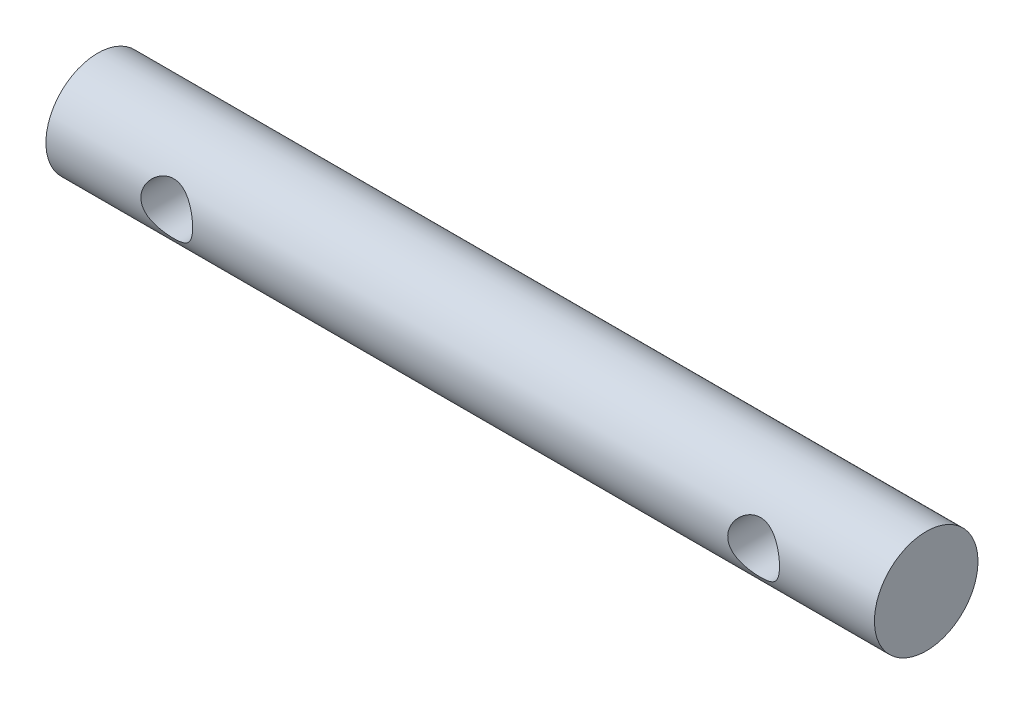
ISO-10303-21;
HEADER;
FILE_DESCRIPTION(('STEP AP214'),'2;1');
FILE_NAME('part.step','',(''),(''),'','','');
FILE_SCHEMA(('AUTOMOTIVE_DESIGN { 1 0 10303 214 1 1 1 1 }'));
ENDSEC;
DATA;
#1=APPLICATION_CONTEXT('core data for automotive mechanical design processes');
#2=APPLICATION_PROTOCOL_DEFINITION('international standard','automotive_design',2000,#1);
#3=PRODUCT_CONTEXT('',#1,'mechanical');
#4=PRODUCT('Part','Part','',(#3));
#5=PRODUCT_RELATED_PRODUCT_CATEGORY('part','',(#4));
#6=PRODUCT_DEFINITION_FORMATION('','',#4);
#7=PRODUCT_DEFINITION_CONTEXT('part definition',#1,'design');
#8=PRODUCT_DEFINITION('design','',#6,#7);
#9=PRODUCT_DEFINITION_SHAPE('','',#8);
#10=(LENGTH_UNIT() NAMED_UNIT(*) SI_UNIT(.MILLI.,.METRE.));
#11=(NAMED_UNIT(*) PLANE_ANGLE_UNIT() SI_UNIT($,.RADIAN.));
#12=(NAMED_UNIT(*) SI_UNIT($,.STERADIAN.) SOLID_ANGLE_UNIT());
#13=UNCERTAINTY_MEASURE_WITH_UNIT(LENGTH_MEASURE(1.E-05),#10,'distance_accuracy_value','');
#14=(GEOMETRIC_REPRESENTATION_CONTEXT(3) GLOBAL_UNCERTAINTY_ASSIGNED_CONTEXT((#13)) GLOBAL_UNIT_ASSIGNED_CONTEXT((#10,
#11,#12)) REPRESENTATION_CONTEXT('',''));
#15=CARTESIAN_POINT('',(0.,0.,0.));
#16=DIRECTION('',(0.,0.,1.));
#17=DIRECTION('',(1.,0.,0.));
#18=AXIS2_PLACEMENT_3D('',#15,#16,#17);
#19=CARTESIAN_POINT('',(48.,0.,0.));
#20=DIRECTION('',(-1.,0.,0.));
#21=DIRECTION('',(0.,0.,1.));
#22=AXIS2_PLACEMENT_3D('',#19,#20,#21);
#23=CYLINDRICAL_SURFACE('',#22,3.);
#24=CARTESIAN_POINT('',(42.5,0.,-3.));
#25=CARTESIAN_POINT('',(42.4999950465242,0.0788579444268505,-2.99999570107562));
#26=CARTESIAN_POINT('',(42.4937448903184,0.157809899546344,-2.99685736529635));
#27=CARTESIAN_POINT('',(42.4690206794877,0.313380352903345,-2.98461234055735));
#28=CARTESIAN_POINT('',(42.4505234105033,0.389994130070446,-2.97549431743379));
#29=CARTESIAN_POINT('',(42.4022092870751,0.538400317320673,-2.95224419105063));
#30=CARTESIAN_POINT('',(42.3724364236281,0.610210204408718,-2.93813158766306));
#31=CARTESIAN_POINT('',(42.3026440679525,0.747708925209896,-2.90618664773642));
#32=CARTESIAN_POINT('',(42.2626253836267,0.813398240985088,-2.88835460450288));
#33=CARTESIAN_POINT('',(42.1707241257721,0.941261726642863,-2.84934387387093));
#34=CARTESIAN_POINT('',(42.1182702811405,1.00298281668316,-2.82802798691306));
#35=CARTESIAN_POINT('',(42.0042177811295,1.11716916730047,-2.78489955370114));
#36=CARTESIAN_POINT('',(41.9426122223413,1.16962737466015,-2.76308664313552));
#37=CARTESIAN_POINT('',(41.8062749757149,1.26787800067542,-2.71948426796021));
#38=CARTESIAN_POINT('',(41.7308958524811,1.31283800332746,-2.69782780455198));
#39=CARTESIAN_POINT('',(41.5724489960207,1.38925234033605,-2.65928968158481));
#40=CARTESIAN_POINT('',(41.4893868069159,1.4207163224495,-2.64240461410484));
#41=CARTESIAN_POINT('',(41.3230023418671,1.46719866328288,-2.61686800556713));
#42=CARTESIAN_POINT('',(41.2399933218989,1.48308878562066,-2.6077840737557));
#43=CARTESIAN_POINT('',(41.0720317433308,1.50064048996327,-2.59772834922791));
#44=CARTESIAN_POINT('',(40.9870811886933,1.50231613255961,-2.59674854014932));
#45=CARTESIAN_POINT('',(40.828570963527,1.49203093075844,-2.60266395385873));
#46=CARTESIAN_POINT('',(40.7548639531654,1.48167683930523,-2.6086314549302));
#47=CARTESIAN_POINT('',(40.6104171359404,1.4504097735854,-2.62614343100775));
#48=CARTESIAN_POINT('',(40.539678282042,1.42949343584648,-2.63768968247664));
#49=CARTESIAN_POINT('',(40.4011563011515,1.37731467057901,-2.66531214619111));
#50=CARTESIAN_POINT('',(40.3334804018213,1.34582260067399,-2.68148760995998));
#51=CARTESIAN_POINT('',(40.204048561115,1.27356253150201,-2.71655106422105));
#52=CARTESIAN_POINT('',(40.1422952965999,1.23279036571871,-2.73544027170286));
#53=CARTESIAN_POINT('',(40.0182181208852,1.13709908236919,-2.77669736854928));
#54=CARTESIAN_POINT('',(39.9568146896358,1.08104168755393,-2.79920265355119));
#55=CARTESIAN_POINT('',(39.8438968721136,0.959333368112065,-2.84321434950611));
#56=CARTESIAN_POINT('',(39.7923872119492,0.893677884861432,-2.86472027938201));
#57=CARTESIAN_POINT('',(39.6984715084554,0.750774758747775,-2.90552980924446));
#58=CARTESIAN_POINT('',(39.6565992913314,0.673130387399114,-2.92468476243011));
#59=CARTESIAN_POINT('',(39.5868544564355,0.510699323233195,-2.95736821681863));
#60=CARTESIAN_POINT('',(39.5589707224772,0.425918364397914,-2.9709011841533));
#61=CARTESIAN_POINT('',(39.520286894425,0.259149737491053,-2.98986500612153));
#62=CARTESIAN_POINT('',(39.5082631463798,0.177512295822489,-2.99587407451965));
#63=CARTESIAN_POINT('',(39.4978029032983,0.0131693999240276,-3.00109520188655));
#64=CARTESIAN_POINT('',(39.4993599715408,-0.0695355298048622,-3.00031048081978));
#65=CARTESIAN_POINT('',(39.5153100326281,-0.226849457978979,-2.99236788380152));
#66=CARTESIAN_POINT('',(39.528698799095,-0.301589112074894,-2.98570868532252));
#67=CARTESIAN_POINT('',(39.5663571078427,-0.447610338452911,-2.9673325697226));
#68=CARTESIAN_POINT('',(39.5906278496802,-0.518891528536629,-2.95561509501618));
#69=CARTESIAN_POINT('',(39.6499976996496,-0.658332912674357,-2.92776377120382));
#70=CARTESIAN_POINT('',(39.6853865751744,-0.726345595508702,-2.91151322654446));
#71=CARTESIAN_POINT('',(39.7656613034698,-0.855692042548905,-2.87615961476126));
#72=CARTESIAN_POINT('',(39.8105512018931,-0.917022944664885,-2.85705533350407));
#73=CARTESIAN_POINT('',(39.9136406379961,-1.03765153393382,-2.81562332004297));
#74=CARTESIAN_POINT('',(39.9727143026677,-1.09615811672854,-2.79316327265249));
#75=CARTESIAN_POINT('',(40.0998877269166,-1.20278448167828,-2.7489358741323));
#76=CARTESIAN_POINT('',(40.1679936782719,-1.25089707856781,-2.7271690110007));
#77=CARTESIAN_POINT('',(40.3154654812595,-1.33756187171853,-2.68576788309734));
#78=CARTESIAN_POINT('',(40.3952168991417,-1.37553824370037,-2.66628794383591));
#79=CARTESIAN_POINT('',(40.5612651013625,-1.43712423890206,-2.63361108441202));
#80=CARTESIAN_POINT('',(40.6475532897003,-1.46075237380053,-2.62040607332625));
#81=CARTESIAN_POINT('',(40.8153653343271,-1.49079253120031,-2.60342251538703));
#82=CARTESIAN_POINT('',(40.8965513801529,-1.49863949460818,-2.59886075197597));
#83=CARTESIAN_POINT('',(41.0591706007468,-1.5010337315643,-2.59748031962405));
#84=CARTESIAN_POINT('',(41.1406036531068,-1.49558676993486,-2.60065829439585));
#85=CARTESIAN_POINT('',(41.2932252523002,-1.47288918838997,-2.61356793076615));
#86=CARTESIAN_POINT('',(41.3646507052171,-1.45681247151455,-2.62264641723987));
#87=CARTESIAN_POINT('',(41.5037121791365,-1.41476303733662,-2.64556524281479));
#88=CARTESIAN_POINT('',(41.571346973138,-1.38878713673988,-2.65940711354502));
#89=CARTESIAN_POINT('',(41.7059372764798,-1.32572361795085,-2.69142795546803));
#90=CARTESIAN_POINT('',(41.7725418527435,-1.28800670672355,-2.70983583593881));
#91=CARTESIAN_POINT('',(41.8989118042719,-1.20322645745609,-2.7485299745229));
#92=CARTESIAN_POINT('',(41.9586735957817,-1.15615825686235,-2.76881720693416));
#93=CARTESIAN_POINT('',(42.077212973532,-1.04730498999207,-2.81193484737138));
#94=CARTESIAN_POINT('',(42.1349886535254,-0.984426634495896,-2.83477474959942));
#95=CARTESIAN_POINT('',(42.2393944751529,-0.8492322093498,-2.87816628389896));
#96=CARTESIAN_POINT('',(42.2860186092049,-0.7769110849578,-2.89871667939292));
#97=CARTESIAN_POINT('',(42.3668545440681,-0.623897395174423,-2.93547014349806));
#98=CARTESIAN_POINT('',(42.4009762538547,-0.5431492556651,-2.95164144740899));
#99=CARTESIAN_POINT('',(42.4547122516361,-0.376113151707133,-2.9775201194848));
#100=CARTESIAN_POINT('',(42.4743677702086,-0.289841699383653,-2.98724585044602));
#101=CARTESIAN_POINT('',(42.4908461166286,-0.168902919736345,-2.99543192870217));
#102=CARTESIAN_POINT('',(42.4942739612995,-0.135242819162349,-2.99714048010376));
#103=CARTESIAN_POINT('',(42.4988519982711,-0.0677275977076379,-2.99942545465223));
#104=CARTESIAN_POINT('',(42.5000021277053,-0.0338724714699429,-3.00000184655071));
#105=CARTESIAN_POINT('',(42.5,0.,-3.));
#106=B_SPLINE_CURVE_WITH_KNOTS('',3,(#24,#25,#26,#27,#28,#29,#30,#31,#32,#33,#34,#35,#36,#37,
#38,#39,#40,#41,#42,#43,#44,#45,#46,#47,#48,#49,#50,#51,#52,#53,#54,#55,#56,#57,#58,#59,#60,#61,
#62,#63,#64,#65,#66,#67,#68,#69,#70,#71,#72,#73,#74,#75,#76,#77,#78,#79,#80,#81,#82,#83,#84,#85,
#86,#87,#88,#89,#90,#91,#92,#93,#94,#95,#96,#97,#98,#99,#100,#101,#102,#103,#104,#105),
.UNSPECIFIED.,.T.,.F.,(4,2,2,2,2,2,2,2,2,2,2,2,2,2,2,2,2,2,2,2,2,2,2,2,2,2,2,2,2,2,2,2,2,2,2,2,
2,2,2,2,4),(0.,0.236436386130439,0.473322224563797,0.709293233238446,0.945245640872352,
1.19547263807713,1.44588935648105,1.71572589646129,1.98536921847422,2.23887018210344,
2.49212035993531,2.71508568613981,2.93812205888518,3.16635360252731,3.39468781890333,
3.65197412000817,3.9093830189803,4.17874533321662,4.4478932536842,4.69474935707019,
4.94148846767215,5.16910359759183,5.39674382446398,5.63089284041848,5.8651417612251,
6.12239415966629,6.37982382923148,6.6497202324259,6.91926767918177,7.16293961254571,
7.40650589797018,7.62686895373285,7.84730293182528,8.08254685170432,8.31791341715447,
8.58187864135758,8.84598575071869,9.11196020495291,9.37717362931725,9.47872920200876,
9.580287577666),.UNSPECIFIED.);
#107=CARTESIAN_POINT('',(42.5,0.,-3.));
#108=VERTEX_POINT('',#107);
#109=EDGE_CURVE('E10',#108,#108,#106,.T.);
#110=ORIENTED_EDGE('',*,*,#109,.T.);
#111=EDGE_LOOP('',(#110));
#112=FACE_BOUND('',#111,.T.);
#113=CARTESIAN_POINT('',(42.5,0.,3.));
#114=CARTESIAN_POINT('',(42.4999950465242,-0.0788579444268505,2.99999570107562));
#115=CARTESIAN_POINT('',(42.4937448903184,-0.157809899546344,2.99685736529635));
#116=CARTESIAN_POINT('',(42.4690206794877,-0.313380352903345,2.98461234055735));
#117=CARTESIAN_POINT('',(42.4505234105033,-0.389994130070446,2.97549431743379));
#118=CARTESIAN_POINT('',(42.4022092870751,-0.538400317320673,2.95224419105063));
#119=CARTESIAN_POINT('',(42.3724364236281,-0.610210204408718,2.93813158766306));
#120=CARTESIAN_POINT('',(42.3026440679525,-0.747708925209896,2.90618664773642));
#121=CARTESIAN_POINT('',(42.2626253836267,-0.813398240985088,2.88835460450288));
#122=CARTESIAN_POINT('',(42.1707241257721,-0.941261726642863,2.84934387387093));
#123=CARTESIAN_POINT('',(42.1182702811405,-1.00298281668316,2.82802798691306));
#124=CARTESIAN_POINT('',(42.0042177811295,-1.11716916730047,2.78489955370114));
#125=CARTESIAN_POINT('',(41.9426122223413,-1.16962737466015,2.76308664313552));
#126=CARTESIAN_POINT('',(41.8062749757149,-1.26787800067542,2.71948426796021));
#127=CARTESIAN_POINT('',(41.7308958524811,-1.31283800332746,2.69782780455198));
#128=CARTESIAN_POINT('',(41.5724489960207,-1.38925234033605,2.65928968158481));
#129=CARTESIAN_POINT('',(41.4893868069159,-1.4207163224495,2.64240461410484));
#130=CARTESIAN_POINT('',(41.3230023418671,-1.46719866328288,2.61686800556713));
#131=CARTESIAN_POINT('',(41.2399933218989,-1.48308878562066,2.6077840737557));
#132=CARTESIAN_POINT('',(41.0720317433308,-1.50064048996327,2.59772834922791));
#133=CARTESIAN_POINT('',(40.9870811886933,-1.50231613255961,2.59674854014932));
#134=CARTESIAN_POINT('',(40.828570963527,-1.49203093075844,2.60266395385873));
#135=CARTESIAN_POINT('',(40.7548639531654,-1.48167683930523,2.6086314549302));
#136=CARTESIAN_POINT('',(40.6104171359404,-1.4504097735854,2.62614343100775));
#137=CARTESIAN_POINT('',(40.539678282042,-1.42949343584648,2.63768968247664));
#138=CARTESIAN_POINT('',(40.4011563011515,-1.37731467057901,2.66531214619111));
#139=CARTESIAN_POINT('',(40.3334804018213,-1.34582260067399,2.68148760995998));
#140=CARTESIAN_POINT('',(40.204048561115,-1.27356253150201,2.71655106422105));
#141=CARTESIAN_POINT('',(40.1422952965999,-1.23279036571871,2.73544027170286));
#142=CARTESIAN_POINT('',(40.0182181208852,-1.13709908236919,2.77669736854928));
#143=CARTESIAN_POINT('',(39.9568146896358,-1.08104168755393,2.79920265355119));
#144=CARTESIAN_POINT('',(39.8438968721136,-0.959333368112065,2.84321434950611));
#145=CARTESIAN_POINT('',(39.7923872119492,-0.893677884861432,2.86472027938201));
#146=CARTESIAN_POINT('',(39.6984715084554,-0.750774758747775,2.90552980924446));
#147=CARTESIAN_POINT('',(39.6565992913314,-0.673130387399114,2.92468476243011));
#148=CARTESIAN_POINT('',(39.5868544564355,-0.510699323233195,2.95736821681863));
#149=CARTESIAN_POINT('',(39.5589707224772,-0.425918364397914,2.9709011841533));
#150=CARTESIAN_POINT('',(39.520286894425,-0.259149737491053,2.98986500612153));
#151=CARTESIAN_POINT('',(39.5082631463798,-0.177512295822489,2.99587407451965));
#152=CARTESIAN_POINT('',(39.4978029032983,-0.0131693999240276,3.00109520188655));
#153=CARTESIAN_POINT('',(39.4993599715408,0.0695355298048622,3.00031048081978));
#154=CARTESIAN_POINT('',(39.5153100326281,0.226849457978979,2.99236788380152));
#155=CARTESIAN_POINT('',(39.528698799095,0.301589112074894,2.98570868532252));
#156=CARTESIAN_POINT('',(39.5663571078427,0.447610338452911,2.9673325697226));
#157=CARTESIAN_POINT('',(39.5906278496802,0.518891528536629,2.95561509501618));
#158=CARTESIAN_POINT('',(39.6499976996496,0.658332912674357,2.92776377120382));
#159=CARTESIAN_POINT('',(39.6853865751744,0.726345595508702,2.91151322654446));
#160=CARTESIAN_POINT('',(39.7656613034698,0.855692042548905,2.87615961476126));
#161=CARTESIAN_POINT('',(39.8105512018931,0.917022944664885,2.85705533350407));
#162=CARTESIAN_POINT('',(39.9136406379961,1.03765153393382,2.81562332004297));
#163=CARTESIAN_POINT('',(39.9727143026677,1.09615811672854,2.79316327265249));
#164=CARTESIAN_POINT('',(40.0998877269166,1.20278448167828,2.7489358741323));
#165=CARTESIAN_POINT('',(40.1679936782719,1.25089707856781,2.7271690110007));
#166=CARTESIAN_POINT('',(40.3154654812595,1.33756187171853,2.68576788309734));
#167=CARTESIAN_POINT('',(40.3952168991417,1.37553824370037,2.66628794383591));
#168=CARTESIAN_POINT('',(40.5612651013625,1.43712423890206,2.63361108441202));
#169=CARTESIAN_POINT('',(40.6475532897003,1.46075237380053,2.62040607332625));
#170=CARTESIAN_POINT('',(40.8153653343271,1.49079253120031,2.60342251538703));
#171=CARTESIAN_POINT('',(40.8965513801529,1.49863949460818,2.59886075197597));
#172=CARTESIAN_POINT('',(41.0591706007468,1.5010337315643,2.59748031962405));
#173=CARTESIAN_POINT('',(41.1406036531068,1.49558676993486,2.60065829439585));
#174=CARTESIAN_POINT('',(41.2932252523002,1.47288918838997,2.61356793076615));
#175=CARTESIAN_POINT('',(41.3646507052171,1.45681247151455,2.62264641723987));
#176=CARTESIAN_POINT('',(41.5037121791365,1.41476303733662,2.64556524281479));
#177=CARTESIAN_POINT('',(41.571346973138,1.38878713673988,2.65940711354502));
#178=CARTESIAN_POINT('',(41.7059372764798,1.32572361795085,2.69142795546803));
#179=CARTESIAN_POINT('',(41.7725418527435,1.28800670672355,2.70983583593881));
#180=CARTESIAN_POINT('',(41.8989118042719,1.20322645745609,2.7485299745229));
#181=CARTESIAN_POINT('',(41.9586735957817,1.15615825686235,2.76881720693416));
#182=CARTESIAN_POINT('',(42.077212973532,1.04730498999207,2.81193484737138));
#183=CARTESIAN_POINT('',(42.1349886535254,0.984426634495896,2.83477474959942));
#184=CARTESIAN_POINT('',(42.2393944751529,0.8492322093498,2.87816628389896));
#185=CARTESIAN_POINT('',(42.2860186092049,0.7769110849578,2.89871667939292));
#186=CARTESIAN_POINT('',(42.3668545440681,0.623897395174423,2.93547014349806));
#187=CARTESIAN_POINT('',(42.4009762538547,0.5431492556651,2.95164144740899));
#188=CARTESIAN_POINT('',(42.4547122516361,0.376113151707133,2.9775201194848));
#189=CARTESIAN_POINT('',(42.4743677702086,0.289841699383653,2.98724585044602));
#190=CARTESIAN_POINT('',(42.4908461166286,0.168902919736345,2.99543192870217));
#191=CARTESIAN_POINT('',(42.4942739612995,0.135242819162349,2.99714048010376));
#192=CARTESIAN_POINT('',(42.4988519982711,0.0677275977076379,2.99942545465223));
#193=CARTESIAN_POINT('',(42.5000021277053,0.0338724714699429,3.00000184655071));
#194=CARTESIAN_POINT('',(42.5,0.,3.));
#195=B_SPLINE_CURVE_WITH_KNOTS('',3,(#113,#114,#115,#116,#117,#118,#119,#120,#121,#122,#123,
#124,#125,#126,#127,#128,#129,#130,#131,#132,#133,#134,#135,#136,#137,#138,#139,#140,#141,#142,
#143,#144,#145,#146,#147,#148,#149,#150,#151,#152,#153,#154,#155,#156,#157,#158,#159,#160,#161,
#162,#163,#164,#165,#166,#167,#168,#169,#170,#171,#172,#173,#174,#175,#176,#177,#178,#179,#180,
#181,#182,#183,#184,#185,#186,#187,#188,#189,#190,#191,#192,#193,#194),.UNSPECIFIED.,.T.,.F.,(4,
2,2,2,2,2,2,2,2,2,2,2,2,2,2,2,2,2,2,2,2,2,2,2,2,2,2,2,2,2,2,2,2,2,2,2,2,2,2,2,4),(0.,
0.236436386130439,0.473322224563797,0.709293233238446,0.945245640872352,1.19547263807713,
1.44588935648105,1.71572589646129,1.98536921847422,2.23887018210344,2.49212035993531,
2.71508568613981,2.93812205888518,3.16635360252731,3.39468781890333,3.65197412000817,
3.9093830189803,4.17874533321662,4.4478932536842,4.69474935707019,4.94148846767215,
5.16910359759183,5.39674382446398,5.63089284041848,5.8651417612251,6.12239415966629,
6.37982382923148,6.6497202324259,6.91926767918177,7.16293961254571,7.40650589797018,
7.62686895373285,7.84730293182528,8.08254685170432,8.31791341715447,8.58187864135758,
8.84598575071869,9.11196020495291,9.37717362931725,9.47872920200876,9.580287577666),.UNSPECIFIED.);
#196=CARTESIAN_POINT('',(42.5,0.,3.));
#197=VERTEX_POINT('',#196);
#198=EDGE_CURVE('E55',#197,#197,#195,.T.);
#199=ORIENTED_EDGE('',*,*,#198,.T.);
#200=EDGE_LOOP('',(#199));
#201=FACE_BOUND('',#200,.T.);
#202=CARTESIAN_POINT('',(8.5,0.,-3.));
#203=CARTESIAN_POINT('',(8.49999504652421,0.0788579444268502,-2.99999570107562));
#204=CARTESIAN_POINT('',(8.49374489031842,0.157809899546344,-2.99685736529635));
#205=CARTESIAN_POINT('',(8.46902067948769,0.313380352903344,-2.98461234055735));
#206=CARTESIAN_POINT('',(8.45052341050328,0.389994130070444,-2.97549431743379));
#207=CARTESIAN_POINT('',(8.40220928707506,0.538400317320673,-2.95224419105063));
#208=CARTESIAN_POINT('',(8.37243642362805,0.610210204408719,-2.93813158766306));
#209=CARTESIAN_POINT('',(8.30264406795252,0.747708925209898,-2.90618664773642));
#210=CARTESIAN_POINT('',(8.2626253836267,0.813398240985089,-2.88835460450288));
#211=CARTESIAN_POINT('',(8.17072412577207,0.941261726642864,-2.84934387387093));
#212=CARTESIAN_POINT('',(8.11827028114054,1.00298281668316,-2.82802798691306));
#213=CARTESIAN_POINT('',(8.00421778112944,1.11716916730047,-2.78489955370114));
#214=CARTESIAN_POINT('',(7.94261222234134,1.16962737466015,-2.76308664313552));
#215=CARTESIAN_POINT('',(7.80627497571493,1.26787800067542,-2.71948426796021));
#216=CARTESIAN_POINT('',(7.73089585248113,1.31283800332746,-2.69782780455198));
#217=CARTESIAN_POINT('',(7.57244899602068,1.38925234033604,-2.65928968158481));
#218=CARTESIAN_POINT('',(7.48938680691588,1.4207163224495,-2.64240461410484));
#219=CARTESIAN_POINT('',(7.32300234186712,1.46719866328288,-2.61686800556713));
#220=CARTESIAN_POINT('',(7.23999332189891,1.48308878562066,-2.6077840737557));
#221=CARTESIAN_POINT('',(7.07203174333078,1.50064048996327,-2.59772834922791));
#222=CARTESIAN_POINT('',(6.98708118869327,1.50231613255961,-2.59674854014932));
#223=CARTESIAN_POINT('',(6.82857096352695,1.49203093075844,-2.60266395385873));
#224=CARTESIAN_POINT('',(6.75486395316542,1.48167683930523,-2.6086314549302));
#225=CARTESIAN_POINT('',(6.61041713594044,1.4504097735854,-2.62614343100775));
#226=CARTESIAN_POINT('',(6.53967828204203,1.42949343584648,-2.63768968247664));
#227=CARTESIAN_POINT('',(6.40115630115151,1.37731467057901,-2.66531214619111));
#228=CARTESIAN_POINT('',(6.33348040182132,1.34582260067399,-2.68148760995998));
#229=CARTESIAN_POINT('',(6.20404856111499,1.273562531502,-2.71655106422105));
#230=CARTESIAN_POINT('',(6.14229529659987,1.2327903657187,-2.73544027170286));
#231=CARTESIAN_POINT('',(6.01821812088516,1.13709908236918,-2.77669736854929));
#232=CARTESIAN_POINT('',(5.95681468963576,1.08104168755392,-2.79920265355119));
#233=CARTESIAN_POINT('',(5.84389687211365,0.95933336811206,-2.84321434950611));
#234=CARTESIAN_POINT('',(5.79238721194918,0.893677884861428,-2.86472027938201));
#235=CARTESIAN_POINT('',(5.69847150845541,0.750774758747773,-2.90552980924446));
#236=CARTESIAN_POINT('',(5.65659929133139,0.673130387399114,-2.92468476243011));
#237=CARTESIAN_POINT('',(5.58685445643549,0.510699323233195,-2.95736821681863));
#238=CARTESIAN_POINT('',(5.55897072247725,0.425918364397914,-2.9709011841533));
#239=CARTESIAN_POINT('',(5.52028689442498,0.259149737491053,-2.98986500612153));
#240=CARTESIAN_POINT('',(5.50826314637983,0.177512295822489,-2.99587407451965));
#241=CARTESIAN_POINT('',(5.49780290329827,0.0131693999240275,-3.00109520188655));
#242=CARTESIAN_POINT('',(5.4993599715408,-0.069535529804863,-3.00031048081978));
#243=CARTESIAN_POINT('',(5.51531003262812,-0.22684945797898,-2.99236788380152));
#244=CARTESIAN_POINT('',(5.52869879909499,-0.301589112074895,-2.98570868532252));
#245=CARTESIAN_POINT('',(5.56635710784268,-0.447610338452912,-2.9673325697226));
#246=CARTESIAN_POINT('',(5.59062784968024,-0.51889152853663,-2.95561509501618));
#247=CARTESIAN_POINT('',(5.64999769964955,-0.658332912674359,-2.92776377120382));
#248=CARTESIAN_POINT('',(5.68538657517443,-0.726345595508705,-2.91151322654446));
#249=CARTESIAN_POINT('',(5.76566130346985,-0.855692042548907,-2.87615961476126));
#250=CARTESIAN_POINT('',(5.81055120189309,-0.917022944664887,-2.85705533350407));
#251=CARTESIAN_POINT('',(5.91364063799607,-1.03765153393382,-2.81562332004297));
#252=CARTESIAN_POINT('',(5.97271430266772,-1.09615811672854,-2.79316327265249));
#253=CARTESIAN_POINT('',(6.09988772691659,-1.20278448167828,-2.7489358741323));
#254=CARTESIAN_POINT('',(6.16799367827188,-1.25089707856781,-2.72716901100071));
#255=CARTESIAN_POINT('',(6.31546548125946,-1.33756187171853,-2.68576788309734));
#256=CARTESIAN_POINT('',(6.39521689914172,-1.37553824370037,-2.66628794383591));
#257=CARTESIAN_POINT('',(6.56126510136245,-1.43712423890206,-2.63361108441202));
#258=CARTESIAN_POINT('',(6.64755328970033,-1.46075237380052,-2.62040607332625));
#259=CARTESIAN_POINT('',(6.81536533432706,-1.49079253120031,-2.60342251538703));
#260=CARTESIAN_POINT('',(6.89655138015286,-1.49863949460818,-2.59886075197597));
#261=CARTESIAN_POINT('',(7.05917060074679,-1.5010337315643,-2.59748031962405));
#262=CARTESIAN_POINT('',(7.14060365310679,-1.49558676993486,-2.60065829439585));
#263=CARTESIAN_POINT('',(7.29322525230016,-1.47288918838996,-2.61356793076615));
#264=CARTESIAN_POINT('',(7.36465070521711,-1.45681247151455,-2.62264641723988));
#265=CARTESIAN_POINT('',(7.50371217913655,-1.41476303733662,-2.64556524281479));
#266=CARTESIAN_POINT('',(7.57134697313805,-1.38878713673988,-2.65940711354503));
#267=CARTESIAN_POINT('',(7.7059372764798,-1.32572361795085,-2.69142795546803));
#268=CARTESIAN_POINT('',(7.77254185274354,-1.28800670672355,-2.70983583593881));
#269=CARTESIAN_POINT('',(7.89891180427189,-1.20322645745609,-2.7485299745229));
#270=CARTESIAN_POINT('',(7.95867359578167,-1.15615825686234,-2.76881720693416));
#271=CARTESIAN_POINT('',(8.07721297353201,-1.04730498999206,-2.81193484737138));
#272=CARTESIAN_POINT('',(8.13498865352544,-0.984426634495892,-2.83477474959942));
#273=CARTESIAN_POINT('',(8.2393944751529,-0.849232209349796,-2.87816628389896));
#274=CARTESIAN_POINT('',(8.28601860920486,-0.776911084957797,-2.89871667939293));
#275=CARTESIAN_POINT('',(8.3668545440681,-0.623897395174419,-2.93547014349806));
#276=CARTESIAN_POINT('',(8.4009762538547,-0.543149255665097,-2.95164144740899));
#277=CARTESIAN_POINT('',(8.45471225163611,-0.376113151707131,-2.9775201194848));
#278=CARTESIAN_POINT('',(8.47436777020857,-0.289841699383651,-2.98724585044602));
#279=CARTESIAN_POINT('',(8.49084611662861,-0.168902919736344,-2.99543192870217));
#280=CARTESIAN_POINT('',(8.49427396129951,-0.135242819162348,-2.99714048010376));
#281=CARTESIAN_POINT('',(8.49885199827113,-0.0677275977076383,-2.99942545465223));
#282=CARTESIAN_POINT('',(8.50000212770531,-0.0338724714699431,-3.00000184655071));
#283=CARTESIAN_POINT('',(8.5,0.,-3.));
#284=B_SPLINE_CURVE_WITH_KNOTS('',3,(#202,#203,#204,#205,#206,#207,#208,#209,#210,#211,#212,
#213,#214,#215,#216,#217,#218,#219,#220,#221,#222,#223,#224,#225,#226,#227,#228,#229,#230,#231,
#232,#233,#234,#235,#236,#237,#238,#239,#240,#241,#242,#243,#244,#245,#246,#247,#248,#249,#250,
#251,#252,#253,#254,#255,#256,#257,#258,#259,#260,#261,#262,#263,#264,#265,#266,#267,#268,#269,
#270,#271,#272,#273,#274,#275,#276,#277,#278,#279,#280,#281,#282,#283),.UNSPECIFIED.,.T.,.F.,(4,
2,2,2,2,2,2,2,2,2,2,2,2,2,2,2,2,2,2,2,2,2,2,2,2,2,2,2,2,2,2,2,2,2,2,2,2,2,2,2,4),(0.,
0.236436386130439,0.473322224563797,0.709293233238447,0.945245640872351,1.19547263807713,
1.44588935648105,1.71572589646129,1.98536921847421,2.23887018210344,2.49212035993531,
2.71508568613981,2.93812205888518,3.16635360252731,3.39468781890333,3.65197412000818,
3.9093830189803,4.17874533321661,4.44789325368419,4.69474935707019,4.94148846767214,
5.16910359759183,5.39674382446397,5.63089284041848,5.86514176122509,6.12239415966628,
6.37982382923148,6.64972023242589,6.91926767918176,7.1629396125457,7.40650589797018,
7.62686895373284,7.84730293182527,8.08254685170431,8.31791341715446,8.58187864135757,
8.84598575071869,9.1119602049529,9.37717362931724,9.47872920200875,9.58028757766599),.UNSPECIFIED.);
#285=CARTESIAN_POINT('',(8.5,0.,-3.));
#286=VERTEX_POINT('',#285);
#287=EDGE_CURVE('E57',#286,#286,#284,.T.);
#288=ORIENTED_EDGE('',*,*,#287,.T.);
#289=EDGE_LOOP('',(#288));
#290=FACE_BOUND('',#289,.T.);
#291=CARTESIAN_POINT('',(8.5,0.,3.));
#292=CARTESIAN_POINT('',(8.49999504652421,-0.0788579444268502,2.99999570107562));
#293=CARTESIAN_POINT('',(8.49374489031842,-0.157809899546344,2.99685736529635));
#294=CARTESIAN_POINT('',(8.46902067948769,-0.313380352903344,2.98461234055735));
#295=CARTESIAN_POINT('',(8.45052341050328,-0.389994130070444,2.97549431743379));
#296=CARTESIAN_POINT('',(8.40220928707506,-0.538400317320673,2.95224419105063));
#297=CARTESIAN_POINT('',(8.37243642362805,-0.610210204408719,2.93813158766306));
#298=CARTESIAN_POINT('',(8.30264406795252,-0.747708925209898,2.90618664773642));
#299=CARTESIAN_POINT('',(8.2626253836267,-0.813398240985089,2.88835460450288));
#300=CARTESIAN_POINT('',(8.17072412577207,-0.941261726642864,2.84934387387093));
#301=CARTESIAN_POINT('',(8.11827028114054,-1.00298281668316,2.82802798691306));
#302=CARTESIAN_POINT('',(8.00421778112944,-1.11716916730047,2.78489955370114));
#303=CARTESIAN_POINT('',(7.94261222234134,-1.16962737466015,2.76308664313552));
#304=CARTESIAN_POINT('',(7.80627497571493,-1.26787800067542,2.71948426796021));
#305=CARTESIAN_POINT('',(7.73089585248113,-1.31283800332746,2.69782780455198));
#306=CARTESIAN_POINT('',(7.57244899602068,-1.38925234033604,2.65928968158481));
#307=CARTESIAN_POINT('',(7.48938680691588,-1.4207163224495,2.64240461410484));
#308=CARTESIAN_POINT('',(7.32300234186712,-1.46719866328288,2.61686800556713));
#309=CARTESIAN_POINT('',(7.23999332189891,-1.48308878562066,2.6077840737557));
#310=CARTESIAN_POINT('',(7.07203174333078,-1.50064048996327,2.59772834922791));
#311=CARTESIAN_POINT('',(6.98708118869327,-1.50231613255961,2.59674854014932));
#312=CARTESIAN_POINT('',(6.82857096352695,-1.49203093075844,2.60266395385873));
#313=CARTESIAN_POINT('',(6.75486395316542,-1.48167683930523,2.6086314549302));
#314=CARTESIAN_POINT('',(6.61041713594044,-1.4504097735854,2.62614343100775));
#315=CARTESIAN_POINT('',(6.53967828204203,-1.42949343584648,2.63768968247664));
#316=CARTESIAN_POINT('',(6.40115630115151,-1.37731467057901,2.66531214619111));
#317=CARTESIAN_POINT('',(6.33348040182132,-1.34582260067399,2.68148760995998));
#318=CARTESIAN_POINT('',(6.20404856111499,-1.273562531502,2.71655106422105));
#319=CARTESIAN_POINT('',(6.14229529659987,-1.2327903657187,2.73544027170286));
#320=CARTESIAN_POINT('',(6.01821812088516,-1.13709908236918,2.77669736854929));
#321=CARTESIAN_POINT('',(5.95681468963576,-1.08104168755392,2.79920265355119));
#322=CARTESIAN_POINT('',(5.84389687211365,-0.95933336811206,2.84321434950611));
#323=CARTESIAN_POINT('',(5.79238721194918,-0.893677884861428,2.86472027938201));
#324=CARTESIAN_POINT('',(5.69847150845541,-0.750774758747773,2.90552980924446));
#325=CARTESIAN_POINT('',(5.65659929133139,-0.673130387399114,2.92468476243011));
#326=CARTESIAN_POINT('',(5.58685445643549,-0.510699323233195,2.95736821681863));
#327=CARTESIAN_POINT('',(5.55897072247725,-0.425918364397914,2.9709011841533));
#328=CARTESIAN_POINT('',(5.52028689442498,-0.259149737491053,2.98986500612153));
#329=CARTESIAN_POINT('',(5.50826314637983,-0.177512295822489,2.99587407451965));
#330=CARTESIAN_POINT('',(5.49780290329827,-0.0131693999240275,3.00109520188655));
#331=CARTESIAN_POINT('',(5.4993599715408,0.069535529804863,3.00031048081978));
#332=CARTESIAN_POINT('',(5.51531003262812,0.22684945797898,2.99236788380152));
#333=CARTESIAN_POINT('',(5.52869879909499,0.301589112074895,2.98570868532252));
#334=CARTESIAN_POINT('',(5.56635710784268,0.447610338452912,2.9673325697226));
#335=CARTESIAN_POINT('',(5.59062784968024,0.51889152853663,2.95561509501618));
#336=CARTESIAN_POINT('',(5.64999769964955,0.658332912674359,2.92776377120382));
#337=CARTESIAN_POINT('',(5.68538657517443,0.726345595508705,2.91151322654446));
#338=CARTESIAN_POINT('',(5.76566130346985,0.855692042548907,2.87615961476126));
#339=CARTESIAN_POINT('',(5.81055120189309,0.917022944664887,2.85705533350407));
#340=CARTESIAN_POINT('',(5.91364063799607,1.03765153393382,2.81562332004297));
#341=CARTESIAN_POINT('',(5.97271430266772,1.09615811672854,2.79316327265249));
#342=CARTESIAN_POINT('',(6.09988772691659,1.20278448167828,2.7489358741323));
#343=CARTESIAN_POINT('',(6.16799367827188,1.25089707856781,2.72716901100071));
#344=CARTESIAN_POINT('',(6.31546548125946,1.33756187171853,2.68576788309734));
#345=CARTESIAN_POINT('',(6.39521689914172,1.37553824370037,2.66628794383591));
#346=CARTESIAN_POINT('',(6.56126510136245,1.43712423890206,2.63361108441202));
#347=CARTESIAN_POINT('',(6.64755328970033,1.46075237380052,2.62040607332625));
#348=CARTESIAN_POINT('',(6.81536533432706,1.49079253120031,2.60342251538703));
#349=CARTESIAN_POINT('',(6.89655138015286,1.49863949460818,2.59886075197597));
#350=CARTESIAN_POINT('',(7.05917060074679,1.5010337315643,2.59748031962405));
#351=CARTESIAN_POINT('',(7.14060365310679,1.49558676993486,2.60065829439585));
#352=CARTESIAN_POINT('',(7.29322525230016,1.47288918838996,2.61356793076615));
#353=CARTESIAN_POINT('',(7.36465070521711,1.45681247151455,2.62264641723988));
#354=CARTESIAN_POINT('',(7.50371217913655,1.41476303733662,2.64556524281479));
#355=CARTESIAN_POINT('',(7.57134697313805,1.38878713673988,2.65940711354503));
#356=CARTESIAN_POINT('',(7.7059372764798,1.32572361795085,2.69142795546803));
#357=CARTESIAN_POINT('',(7.77254185274354,1.28800670672355,2.70983583593881));
#358=CARTESIAN_POINT('',(7.89891180427189,1.20322645745609,2.7485299745229));
#359=CARTESIAN_POINT('',(7.95867359578167,1.15615825686234,2.76881720693416));
#360=CARTESIAN_POINT('',(8.07721297353201,1.04730498999206,2.81193484737138));
#361=CARTESIAN_POINT('',(8.13498865352544,0.984426634495892,2.83477474959942));
#362=CARTESIAN_POINT('',(8.2393944751529,0.849232209349796,2.87816628389896));
#363=CARTESIAN_POINT('',(8.28601860920486,0.776911084957797,2.89871667939293));
#364=CARTESIAN_POINT('',(8.3668545440681,0.623897395174419,2.93547014349806));
#365=CARTESIAN_POINT('',(8.4009762538547,0.543149255665097,2.95164144740899));
#366=CARTESIAN_POINT('',(8.45471225163611,0.376113151707131,2.9775201194848));
#367=CARTESIAN_POINT('',(8.47436777020857,0.289841699383651,2.98724585044602));
#368=CARTESIAN_POINT('',(8.49084611662861,0.168902919736344,2.99543192870217));
#369=CARTESIAN_POINT('',(8.49427396129951,0.135242819162348,2.99714048010376));
#370=CARTESIAN_POINT('',(8.49885199827113,0.0677275977076383,2.99942545465223));
#371=CARTESIAN_POINT('',(8.50000212770531,0.0338724714699431,3.00000184655071));
#372=CARTESIAN_POINT('',(8.5,0.,3.));
#373=B_SPLINE_CURVE_WITH_KNOTS('',3,(#291,#292,#293,#294,#295,#296,#297,#298,#299,#300,#301,
#302,#303,#304,#305,#306,#307,#308,#309,#310,#311,#312,#313,#314,#315,#316,#317,#318,#319,#320,
#321,#322,#323,#324,#325,#326,#327,#328,#329,#330,#331,#332,#333,#334,#335,#336,#337,#338,#339,
#340,#341,#342,#343,#344,#345,#346,#347,#348,#349,#350,#351,#352,#353,#354,#355,#356,#357,#358,
#359,#360,#361,#362,#363,#364,#365,#366,#367,#368,#369,#370,#371,#372),.UNSPECIFIED.,.T.,.F.,(4,
2,2,2,2,2,2,2,2,2,2,2,2,2,2,2,2,2,2,2,2,2,2,2,2,2,2,2,2,2,2,2,2,2,2,2,2,2,2,2,4),(0.,
0.236436386130439,0.473322224563797,0.709293233238447,0.945245640872351,1.19547263807713,
1.44588935648105,1.71572589646129,1.98536921847421,2.23887018210344,2.49212035993531,
2.71508568613981,2.93812205888518,3.16635360252731,3.39468781890333,3.65197412000818,
3.9093830189803,4.17874533321661,4.44789325368419,4.69474935707019,4.94148846767214,
5.16910359759183,5.39674382446397,5.63089284041848,5.86514176122509,6.12239415966628,
6.37982382923148,6.64972023242589,6.91926767918176,7.1629396125457,7.40650589797018,
7.62686895373284,7.84730293182527,8.08254685170431,8.31791341715446,8.58187864135757,
8.84598575071869,9.1119602049529,9.37717362931724,9.47872920200875,9.58028757766599),.UNSPECIFIED.);
#374=CARTESIAN_POINT('',(8.5,0.,3.));
#375=VERTEX_POINT('',#374);
#376=EDGE_CURVE('E58',#375,#375,#373,.T.);
#377=ORIENTED_EDGE('',*,*,#376,.T.);
#378=EDGE_LOOP('',(#377));
#379=FACE_BOUND('',#378,.T.);
#380=CARTESIAN_POINT('',(48.,0.,0.));
#381=DIRECTION('',(1.,0.,0.));
#382=DIRECTION('',(0.,0.,-1.));
#383=AXIS2_PLACEMENT_3D('',#380,#381,#382);
#384=CIRCLE('',#383,3.);
#385=CARTESIAN_POINT('',(48.,0.,-3.));
#386=VERTEX_POINT('',#385);
#387=EDGE_CURVE('E86',#386,#386,#384,.T.);
#388=ORIENTED_EDGE('',*,*,#387,.F.);
#389=EDGE_LOOP('',(#388));
#390=FACE_BOUND('',#389,.T.);
#391=CARTESIAN_POINT('',(0.,0.,0.));
#392=DIRECTION('',(1.,0.,0.));
#393=DIRECTION('',(0.,0.,-1.));
#394=AXIS2_PLACEMENT_3D('',#391,#392,#393);
#395=CIRCLE('',#394,3.);
#396=CARTESIAN_POINT('',(0.,0.,-3.));
#397=VERTEX_POINT('',#396);
#398=EDGE_CURVE('E90',#397,#397,#395,.T.);
#399=ORIENTED_EDGE('',*,*,#398,.T.);
#400=EDGE_LOOP('',(#399));
#401=FACE_BOUND('',#400,.T.);
#402=ADVANCED_FACE('F41',(#112,#201,#290,#379,#390,#401),#23,.T.);
#403=CARTESIAN_POINT('',(48.,0.,0.));
#404=DIRECTION('',(1.,0.,0.));
#405=DIRECTION('',(0.,0.,-1.));
#406=AXIS2_PLACEMENT_3D('',#403,#404,#405);
#407=PLANE('',#406);
#408=ORIENTED_EDGE('',*,*,#387,.T.);
#409=EDGE_LOOP('',(#408));
#410=FACE_BOUND('',#409,.T.);
#411=ADVANCED_FACE('F84',(#410),#407,.T.);
#412=CARTESIAN_POINT('',(0.,0.,0.));
#413=DIRECTION('',(1.,0.,0.));
#414=DIRECTION('',(0.,0.,-1.));
#415=AXIS2_PLACEMENT_3D('',#412,#413,#414);
#416=PLANE('',#415);
#417=ORIENTED_EDGE('',*,*,#398,.F.);
#418=EDGE_LOOP('',(#417));
#419=FACE_BOUND('',#418,.T.);
#420=ADVANCED_FACE('F78',(#419),#416,.F.);
#421=CARTESIAN_POINT('',(7.,0.,-3.));
#422=DIRECTION('',(0.,0.,1.));
#423=DIRECTION('',(1.,0.,0.));
#424=AXIS2_PLACEMENT_3D('',#421,#422,#423);
#425=CYLINDRICAL_SURFACE('',#424,1.5);
#426=ORIENTED_EDGE('',*,*,#376,.F.);
#427=EDGE_LOOP('',(#426));
#428=FACE_BOUND('',#427,.T.);
#429=ORIENTED_EDGE('',*,*,#287,.F.);
#430=EDGE_LOOP('',(#429));
#431=FACE_BOUND('',#430,.T.);
#432=ADVANCED_FACE('F71',(#428,#431),#425,.F.);
#433=CARTESIAN_POINT('',(41.,0.,-3.));
#434=DIRECTION('',(0.,0.,1.));
#435=DIRECTION('',(1.,0.,0.));
#436=AXIS2_PLACEMENT_3D('',#433,#434,#435);
#437=CYLINDRICAL_SURFACE('',#436,1.5);
#438=ORIENTED_EDGE('',*,*,#198,.F.);
#439=EDGE_LOOP('',(#438));
#440=FACE_BOUND('',#439,.T.);
#441=ORIENTED_EDGE('',*,*,#109,.F.);
#442=EDGE_LOOP('',(#441));
#443=FACE_BOUND('',#442,.T.);
#444=ADVANCED_FACE('F67',(#440,#443),#437,.F.);
#445=CLOSED_SHELL('',(#402,#411,#420,#432,#444));
#446=MANIFOLD_SOLID_BREP('B2',#445);
#447=ADVANCED_BREP_SHAPE_REPRESENTATION('',(#18,#446),#14);
#448=SHAPE_DEFINITION_REPRESENTATION(#9,#447);
ENDSEC;
END-ISO-10303-21;
